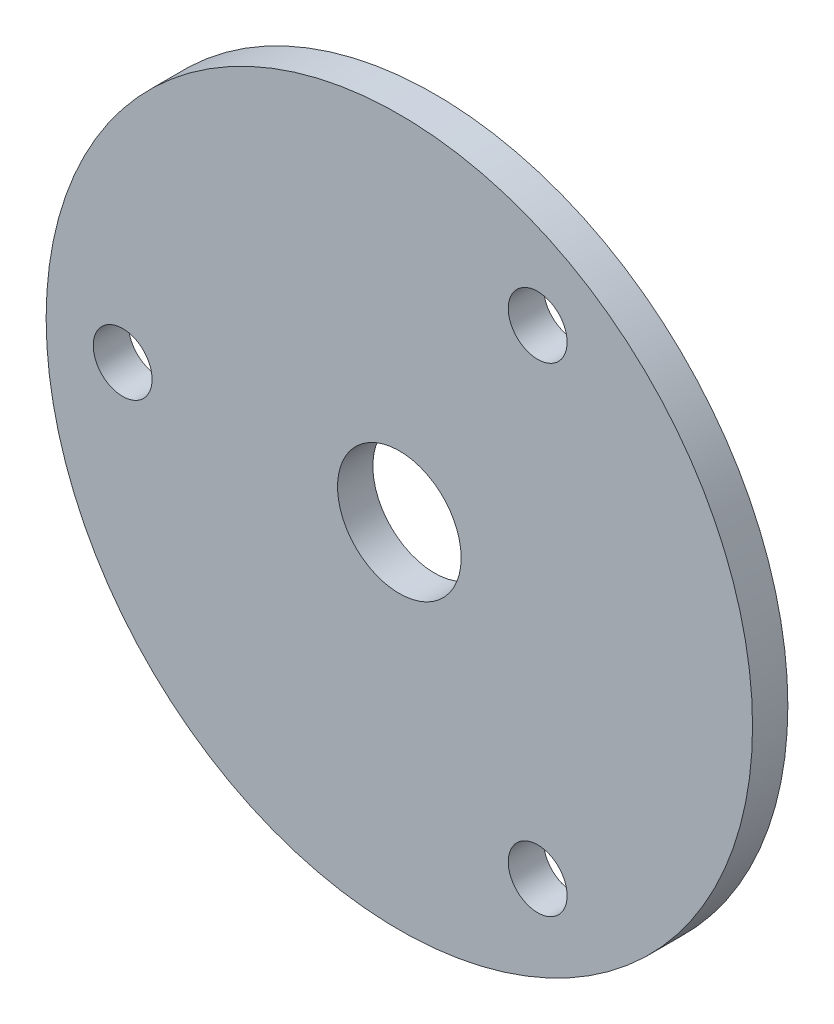
ISO-10303-21;
HEADER;
FILE_DESCRIPTION(('STEP AP214'),'2;1');
FILE_NAME('part.step','',(''),(''),'','','');
FILE_SCHEMA(('AUTOMOTIVE_DESIGN { 1 0 10303 214 1 1 1 1 }'));
ENDSEC;
DATA;
#1=APPLICATION_CONTEXT('core data for automotive mechanical design processes');
#2=APPLICATION_PROTOCOL_DEFINITION('international standard','automotive_design',2000,#1);
#3=PRODUCT_CONTEXT('',#1,'mechanical');
#4=PRODUCT('Part','Part','',(#3));
#5=PRODUCT_RELATED_PRODUCT_CATEGORY('part','',(#4));
#6=PRODUCT_DEFINITION_FORMATION('','',#4);
#7=PRODUCT_DEFINITION_CONTEXT('part definition',#1,'design');
#8=PRODUCT_DEFINITION('design','',#6,#7);
#9=PRODUCT_DEFINITION_SHAPE('','',#8);
#10=(LENGTH_UNIT() NAMED_UNIT(*) SI_UNIT(.MILLI.,.METRE.));
#11=(NAMED_UNIT(*) PLANE_ANGLE_UNIT() SI_UNIT($,.RADIAN.));
#12=(NAMED_UNIT(*) SI_UNIT($,.STERADIAN.) SOLID_ANGLE_UNIT());
#13=UNCERTAINTY_MEASURE_WITH_UNIT(LENGTH_MEASURE(1.E-05),#10,'distance_accuracy_value','');
#14=(GEOMETRIC_REPRESENTATION_CONTEXT(3) GLOBAL_UNCERTAINTY_ASSIGNED_CONTEXT((#13)) GLOBAL_UNIT_ASSIGNED_CONTEXT((#10,
#11,#12)) REPRESENTATION_CONTEXT('',''));
#15=CARTESIAN_POINT('',(0.,0.,0.));
#16=DIRECTION('',(0.,0.,1.));
#17=DIRECTION('',(1.,0.,0.));
#18=AXIS2_PLACEMENT_3D('',#15,#16,#17);
#19=CARTESIAN_POINT('',(0.,0.,3.));
#20=DIRECTION('',(0.,0.,1.));
#21=DIRECTION('',(1.,0.,0.));
#22=AXIS2_PLACEMENT_3D('',#19,#20,#21);
#23=PLANE('',#22);
#24=CARTESIAN_POINT('',(11.75,20.3515969889343,3.));
#25=DIRECTION('',(0.,0.,1.));
#26=DIRECTION('',(1.,0.,0.));
#27=AXIS2_PLACEMENT_3D('',#24,#25,#26);
#28=CIRCLE('',#27,2.5);
#29=CARTESIAN_POINT('',(14.25,20.3515969889343,3.));
#30=VERTEX_POINT('',#29);
#31=EDGE_CURVE('E70',#30,#30,#28,.T.);
#32=ORIENTED_EDGE('',*,*,#31,.F.);
#33=EDGE_LOOP('',(#32));
#34=FACE_BOUND('',#33,.T.);
#35=CARTESIAN_POINT('',(-23.5,0.,3.));
#36=DIRECTION('',(0.,0.,1.));
#37=DIRECTION('',(1.,0.,0.));
#38=AXIS2_PLACEMENT_3D('',#35,#36,#37);
#39=CIRCLE('',#38,2.5);
#40=CARTESIAN_POINT('',(-21.,0.,3.));
#41=VERTEX_POINT('',#40);
#42=EDGE_CURVE('E56',#41,#41,#39,.T.);
#43=ORIENTED_EDGE('',*,*,#42,.F.);
#44=EDGE_LOOP('',(#43));
#45=FACE_BOUND('',#44,.T.);
#46=CARTESIAN_POINT('',(0.,0.,3.));
#47=DIRECTION('',(0.,0.,1.));
#48=DIRECTION('',(1.,0.,0.));
#49=AXIS2_PLACEMENT_3D('',#46,#47,#48);
#50=CIRCLE('',#49,30.);
#51=CARTESIAN_POINT('',(30.,0.,3.));
#52=VERTEX_POINT('',#51);
#53=EDGE_CURVE('E10',#52,#52,#50,.T.);
#54=ORIENTED_EDGE('',*,*,#53,.T.);
#55=EDGE_LOOP('',(#54));
#56=FACE_BOUND('',#55,.T.);
#57=CARTESIAN_POINT('',(11.75,-20.3515969889343,3.));
#58=DIRECTION('',(0.,0.,1.));
#59=DIRECTION('',(1.,0.,0.));
#60=AXIS2_PLACEMENT_3D('',#57,#58,#59);
#61=CIRCLE('',#60,2.5);
#62=CARTESIAN_POINT('',(14.25,-20.3515969889343,3.));
#63=VERTEX_POINT('',#62);
#64=EDGE_CURVE('E62',#63,#63,#61,.T.);
#65=ORIENTED_EDGE('',*,*,#64,.F.);
#66=EDGE_LOOP('',(#65));
#67=FACE_BOUND('',#66,.T.);
#68=CARTESIAN_POINT('',(0.,0.,3.));
#69=DIRECTION('',(0.,0.,1.));
#70=DIRECTION('',(1.,0.,0.));
#71=AXIS2_PLACEMENT_3D('',#68,#69,#70);
#72=CIRCLE('',#71,5.25);
#73=CARTESIAN_POINT('',(5.25,0.,3.));
#74=VERTEX_POINT('',#73);
#75=EDGE_CURVE('E78',#74,#74,#72,.T.);
#76=ORIENTED_EDGE('',*,*,#75,.F.);
#77=EDGE_LOOP('',(#76));
#78=FACE_BOUND('',#77,.T.);
#79=ADVANCED_FACE('F43',(#34,#45,#56,#67,#78),#23,.T.);
#80=CARTESIAN_POINT('',(0.,0.,0.));
#81=DIRECTION('',(0.,0.,1.));
#82=DIRECTION('',(1.,0.,0.));
#83=AXIS2_PLACEMENT_3D('',#80,#81,#82);
#84=PLANE('',#83);
#85=CARTESIAN_POINT('',(0.,0.,0.));
#86=DIRECTION('',(0.,0.,1.));
#87=DIRECTION('',(1.,0.,0.));
#88=AXIS2_PLACEMENT_3D('',#85,#86,#87);
#89=CIRCLE('',#88,30.);
#90=CARTESIAN_POINT('',(30.,0.,0.));
#91=VERTEX_POINT('',#90);
#92=EDGE_CURVE('E47',#91,#91,#89,.T.);
#93=ORIENTED_EDGE('',*,*,#92,.F.);
#94=EDGE_LOOP('',(#93));
#95=FACE_BOUND('',#94,.T.);
#96=CARTESIAN_POINT('',(-23.5,0.,0.));
#97=DIRECTION('',(0.,0.,1.));
#98=DIRECTION('',(1.,0.,0.));
#99=AXIS2_PLACEMENT_3D('',#96,#97,#98);
#100=CIRCLE('',#99,2.5);
#101=CARTESIAN_POINT('',(-21.,0.,0.));
#102=VERTEX_POINT('',#101);
#103=EDGE_CURVE('E58',#102,#102,#100,.T.);
#104=ORIENTED_EDGE('',*,*,#103,.T.);
#105=EDGE_LOOP('',(#104));
#106=FACE_BOUND('',#105,.T.);
#107=CARTESIAN_POINT('',(11.75,-20.3515969889343,0.));
#108=DIRECTION('',(0.,0.,1.));
#109=DIRECTION('',(1.,0.,0.));
#110=AXIS2_PLACEMENT_3D('',#107,#108,#109);
#111=CIRCLE('',#110,2.5);
#112=CARTESIAN_POINT('',(14.25,-20.3515969889343,0.));
#113=VERTEX_POINT('',#112);
#114=EDGE_CURVE('E66',#113,#113,#111,.T.);
#115=ORIENTED_EDGE('',*,*,#114,.T.);
#116=EDGE_LOOP('',(#115));
#117=FACE_BOUND('',#116,.T.);
#118=CARTESIAN_POINT('',(11.75,20.3515969889343,0.));
#119=DIRECTION('',(0.,0.,1.));
#120=DIRECTION('',(1.,0.,0.));
#121=AXIS2_PLACEMENT_3D('',#118,#119,#120);
#122=CIRCLE('',#121,2.5);
#123=CARTESIAN_POINT('',(14.25,20.3515969889343,0.));
#124=VERTEX_POINT('',#123);
#125=EDGE_CURVE('E74',#124,#124,#122,.T.);
#126=ORIENTED_EDGE('',*,*,#125,.T.);
#127=EDGE_LOOP('',(#126));
#128=FACE_BOUND('',#127,.T.);
#129=CARTESIAN_POINT('',(0.,0.,0.));
#130=DIRECTION('',(0.,0.,1.));
#131=DIRECTION('',(1.,0.,0.));
#132=AXIS2_PLACEMENT_3D('',#129,#130,#131);
#133=CIRCLE('',#132,5.25);
#134=CARTESIAN_POINT('',(5.25,0.,0.));
#135=VERTEX_POINT('',#134);
#136=EDGE_CURVE('E82',#135,#135,#133,.T.);
#137=ORIENTED_EDGE('',*,*,#136,.T.);
#138=EDGE_LOOP('',(#137));
#139=FACE_BOUND('',#138,.T.);
#140=ADVANCED_FACE('F94',(#95,#106,#117,#128,#139),#84,.F.);
#141=CARTESIAN_POINT('',(0.,0.,3.));
#142=DIRECTION('',(0.,0.,-1.));
#143=DIRECTION('',(-1.,0.,0.));
#144=AXIS2_PLACEMENT_3D('',#141,#142,#143);
#145=CYLINDRICAL_SURFACE('',#144,30.);
#146=ORIENTED_EDGE('',*,*,#53,.F.);
#147=EDGE_LOOP('',(#146));
#148=FACE_BOUND('',#147,.T.);
#149=ORIENTED_EDGE('',*,*,#92,.T.);
#150=EDGE_LOOP('',(#149));
#151=FACE_BOUND('',#150,.T.);
#152=ADVANCED_FACE('F45',(#148,#151),#145,.T.);
#153=CARTESIAN_POINT('',(-23.5,0.,3.));
#154=DIRECTION('',(0.,0.,-1.));
#155=DIRECTION('',(-1.,0.,0.));
#156=AXIS2_PLACEMENT_3D('',#153,#154,#155);
#157=CYLINDRICAL_SURFACE('',#156,2.5);
#158=ORIENTED_EDGE('',*,*,#42,.T.);
#159=EDGE_LOOP('',(#158));
#160=FACE_BOUND('',#159,.T.);
#161=ORIENTED_EDGE('',*,*,#103,.F.);
#162=EDGE_LOOP('',(#161));
#163=FACE_BOUND('',#162,.T.);
#164=ADVANCED_FACE('F104',(#160,#163),#157,.F.);
#165=CARTESIAN_POINT('',(11.75,-20.3515969889343,3.));
#166=DIRECTION('',(0.,0.,-1.));
#167=DIRECTION('',(-1.,0.,0.));
#168=AXIS2_PLACEMENT_3D('',#165,#166,#167);
#169=CYLINDRICAL_SURFACE('',#168,2.5);
#170=ORIENTED_EDGE('',*,*,#64,.T.);
#171=EDGE_LOOP('',(#170));
#172=FACE_BOUND('',#171,.T.);
#173=ORIENTED_EDGE('',*,*,#114,.F.);
#174=EDGE_LOOP('',(#173));
#175=FACE_BOUND('',#174,.T.);
#176=ADVANCED_FACE('F107',(#172,#175),#169,.F.);
#177=CARTESIAN_POINT('',(11.75,20.3515969889343,3.));
#178=DIRECTION('',(0.,0.,-1.));
#179=DIRECTION('',(-1.,0.,0.));
#180=AXIS2_PLACEMENT_3D('',#177,#178,#179);
#181=CYLINDRICAL_SURFACE('',#180,2.5);
#182=ORIENTED_EDGE('',*,*,#31,.T.);
#183=EDGE_LOOP('',(#182));
#184=FACE_BOUND('',#183,.T.);
#185=ORIENTED_EDGE('',*,*,#125,.F.);
#186=EDGE_LOOP('',(#185));
#187=FACE_BOUND('',#186,.T.);
#188=ADVANCED_FACE('F111',(#184,#187),#181,.F.);
#189=CARTESIAN_POINT('',(0.,0.,3.));
#190=DIRECTION('',(0.,0.,-1.));
#191=DIRECTION('',(-1.,0.,0.));
#192=AXIS2_PLACEMENT_3D('',#189,#190,#191);
#193=CYLINDRICAL_SURFACE('',#192,5.25);
#194=ORIENTED_EDGE('',*,*,#75,.T.);
#195=EDGE_LOOP('',(#194));
#196=FACE_BOUND('',#195,.T.);
#197=ORIENTED_EDGE('',*,*,#136,.F.);
#198=EDGE_LOOP('',(#197));
#199=FACE_BOUND('',#198,.T.);
#200=ADVANCED_FACE('F90',(#196,#199),#193,.F.);
#201=CLOSED_SHELL('',(#79,#140,#152,#164,#176,#188,#200));
#202=MANIFOLD_SOLID_BREP('B2',#201);
#203=ADVANCED_BREP_SHAPE_REPRESENTATION('',(#18,#202),#14);
#204=SHAPE_DEFINITION_REPRESENTATION(#9,#203);
ENDSEC;
END-ISO-10303-21;
